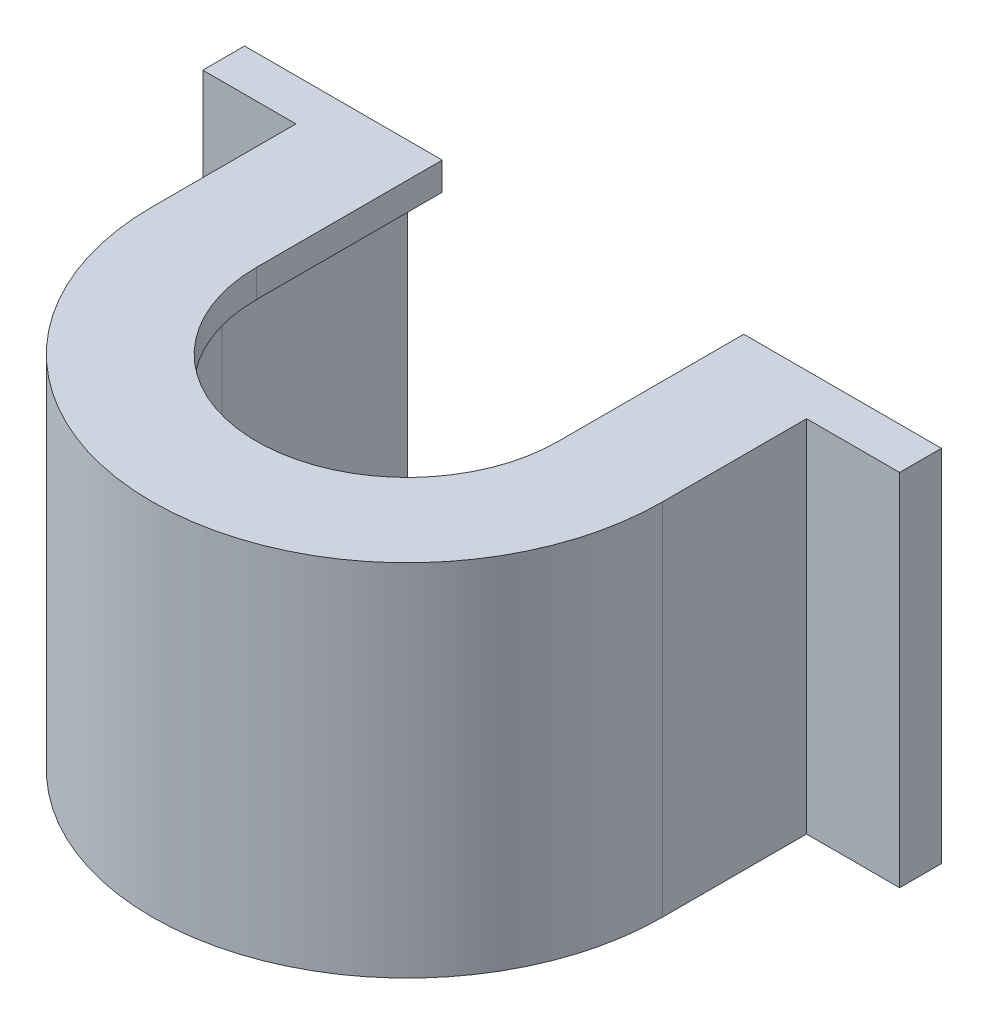
ISO-10303-21;
HEADER;
FILE_DESCRIPTION(('STEP AP214'),'2;1');
FILE_NAME('part.step','',(''),(''),'','','');
FILE_SCHEMA(('AUTOMOTIVE_DESIGN { 1 0 10303 214 1 1 1 1 }'));
ENDSEC;
DATA;
#1=APPLICATION_CONTEXT('core data for automotive mechanical design processes');
#2=APPLICATION_PROTOCOL_DEFINITION('international standard','automotive_design',2000,#1);
#3=PRODUCT_CONTEXT('',#1,'mechanical');
#4=PRODUCT('Part','Part','',(#3));
#5=PRODUCT_RELATED_PRODUCT_CATEGORY('part','',(#4));
#6=PRODUCT_DEFINITION_FORMATION('','',#4);
#7=PRODUCT_DEFINITION_CONTEXT('part definition',#1,'design');
#8=PRODUCT_DEFINITION('design','',#6,#7);
#9=PRODUCT_DEFINITION_SHAPE('','',#8);
#10=(LENGTH_UNIT() NAMED_UNIT(*) SI_UNIT(.MILLI.,.METRE.));
#11=(NAMED_UNIT(*) PLANE_ANGLE_UNIT() SI_UNIT($,.RADIAN.));
#12=(NAMED_UNIT(*) SI_UNIT($,.STERADIAN.) SOLID_ANGLE_UNIT());
#13=UNCERTAINTY_MEASURE_WITH_UNIT(LENGTH_MEASURE(1.E-05),#10,'distance_accuracy_value','');
#14=(GEOMETRIC_REPRESENTATION_CONTEXT(3) GLOBAL_UNCERTAINTY_ASSIGNED_CONTEXT((#13)) GLOBAL_UNIT_ASSIGNED_CONTEXT((#10,
#11,#12)) REPRESENTATION_CONTEXT('',''));
#15=CARTESIAN_POINT('',(0.,0.,0.));
#16=DIRECTION('',(0.,0.,1.));
#17=DIRECTION('',(1.,0.,0.));
#18=AXIS2_PLACEMENT_3D('',#15,#16,#17);
#19=CARTESIAN_POINT('',(-18.32,20.,0.));
#20=DIRECTION('',(-1.,0.,0.));
#21=DIRECTION('',(0.,0.,1.));
#22=AXIS2_PLACEMENT_3D('',#19,#20,#21);
#23=PLANE('',#22);
#24=DIRECTION('',(0.,0.,-1.));
#25=VECTOR('',#24,1.);
#26=CARTESIAN_POINT('',(-18.32,8.89,0.));
#27=LINE('',#26,#25);
#28=CARTESIAN_POINT('',(-18.32,8.89,0.));
#29=VERTEX_POINT('',#28);
#30=CARTESIAN_POINT('',(-18.32,8.89,-10.32));
#31=VERTEX_POINT('',#30);
#32=EDGE_CURVE('E53',#29,#31,#27,.T.);
#33=ORIENTED_EDGE('',*,*,#32,.F.);
#34=DIRECTION('',(0.,-1.,0.));
#35=VECTOR('',#34,1.);
#36=CARTESIAN_POINT('',(-18.32,20.,0.));
#37=LINE('',#36,#35);
#38=CARTESIAN_POINT('',(-18.32,34.7,0.));
#39=VERTEX_POINT('',#38);
#40=EDGE_CURVE('E46',#39,#29,#37,.T.);
#41=ORIENTED_EDGE('',*,*,#40,.F.);
#42=DIRECTION('',(0.,0.,1.));
#43=VECTOR('',#42,1.);
#44=CARTESIAN_POINT('',(-18.32,34.7,0.));
#45=LINE('',#44,#43);
#46=CARTESIAN_POINT('',(-18.32,34.7,-10.32));
#47=VERTEX_POINT('',#46);
#48=EDGE_CURVE('E224',#47,#39,#45,.T.);
#49=ORIENTED_EDGE('',*,*,#48,.F.);
#50=DIRECTION('',(0.,-1.,0.));
#51=VECTOR('',#50,1.);
#52=CARTESIAN_POINT('',(-18.32,20.,-10.32));
#53=LINE('',#52,#51);
#54=EDGE_CURVE('E182',#47,#31,#53,.T.);
#55=ORIENTED_EDGE('',*,*,#54,.T.);
#56=EDGE_LOOP('',(#33,#41,#49,#55));
#57=FACE_BOUND('',#56,.T.);
#58=ADVANCED_FACE('F38',(#57),#23,.T.);
#59=CARTESIAN_POINT('',(0.,20.,0.));
#60=DIRECTION('',(0.,-1.,0.));
#61=DIRECTION('',(0.,0.,-1.));
#62=AXIS2_PLACEMENT_3D('',#59,#60,#61);
#63=CYLINDRICAL_SURFACE('',#62,18.32);
#64=ORIENTED_EDGE('',*,*,#40,.T.);
#65=CARTESIAN_POINT('',(0.,8.89,0.));
#66=DIRECTION('',(0.,1.,0.));
#67=DIRECTION('',(-1.,0.,0.));
#68=AXIS2_PLACEMENT_3D('',#65,#66,#67);
#69=CIRCLE('',#68,18.32);
#70=CARTESIAN_POINT('',(18.32,8.89,0.));
#71=VERTEX_POINT('',#70);
#72=EDGE_CURVE('E217',#29,#71,#69,.T.);
#73=ORIENTED_EDGE('',*,*,#72,.T.);
#74=DIRECTION('',(0.,-1.,0.));
#75=VECTOR('',#74,1.);
#76=CARTESIAN_POINT('',(18.32,20.,0.));
#77=LINE('',#76,#75);
#78=CARTESIAN_POINT('',(18.32,34.7,0.));
#79=VERTEX_POINT('',#78);
#80=EDGE_CURVE('E208',#79,#71,#77,.T.);
#81=ORIENTED_EDGE('',*,*,#80,.F.);
#82=CARTESIAN_POINT('',(0.,34.7,0.));
#83=DIRECTION('',(0.,1.,0.));
#84=DIRECTION('',(0.,0.,1.));
#85=AXIS2_PLACEMENT_3D('',#82,#83,#84);
#86=CIRCLE('',#85,18.32);
#87=EDGE_CURVE('E219',#39,#79,#86,.T.);
#88=ORIENTED_EDGE('',*,*,#87,.F.);
#89=EDGE_LOOP('',(#64,#73,#81,#88));
#90=FACE_BOUND('',#89,.T.);
#91=ADVANCED_FACE('F216',(#90),#63,.T.);
#92=CARTESIAN_POINT('',(18.32,20.,0.));
#93=DIRECTION('',(-1.,0.,0.));
#94=DIRECTION('',(0.,0.,1.));
#95=AXIS2_PLACEMENT_3D('',#92,#93,#94);
#96=PLANE('',#95);
#97=ORIENTED_EDGE('',*,*,#80,.T.);
#98=DIRECTION('',(0.,0.,-1.));
#99=VECTOR('',#98,1.);
#100=CARTESIAN_POINT('',(18.32,8.89,0.));
#101=LINE('',#100,#99);
#102=CARTESIAN_POINT('',(18.32,8.89,-10.32));
#103=VERTEX_POINT('',#102);
#104=EDGE_CURVE('E334',#71,#103,#101,.T.);
#105=ORIENTED_EDGE('',*,*,#104,.T.);
#106=DIRECTION('',(0.,-1.,0.));
#107=VECTOR('',#106,1.);
#108=CARTESIAN_POINT('',(18.32,20.,-10.32));
#109=LINE('',#108,#107);
#110=CARTESIAN_POINT('',(18.32,34.7,-10.32));
#111=VERTEX_POINT('',#110);
#112=EDGE_CURVE('E204',#111,#103,#109,.T.);
#113=ORIENTED_EDGE('',*,*,#112,.F.);
#114=DIRECTION('',(0.,0.,-1.));
#115=VECTOR('',#114,1.);
#116=CARTESIAN_POINT('',(18.32,34.7,0.));
#117=LINE('',#116,#115);
#118=EDGE_CURVE('E236',#79,#111,#117,.T.);
#119=ORIENTED_EDGE('',*,*,#118,.F.);
#120=EDGE_LOOP('',(#97,#105,#113,#119));
#121=FACE_BOUND('',#120,.T.);
#122=ADVANCED_FACE('F342',(#121),#96,.F.);
#123=CARTESIAN_POINT('',(0.,20.,-10.32));
#124=DIRECTION('',(0.,0.,1.));
#125=DIRECTION('',(1.,0.,0.));
#126=AXIS2_PLACEMENT_3D('',#123,#124,#125);
#127=PLANE('',#126);
#128=DIRECTION('',(-1.,0.,0.));
#129=VECTOR('',#128,1.);
#130=CARTESIAN_POINT('',(0.,8.89,-10.32));
#131=LINE('',#130,#129);
#132=CARTESIAN_POINT('',(25.,8.89,-10.32));
#133=VERTEX_POINT('',#132);
#134=EDGE_CURVE('E331',#133,#103,#131,.T.);
#135=ORIENTED_EDGE('',*,*,#134,.F.);
#136=DIRECTION('',(0.,-1.,0.));
#137=VECTOR('',#136,1.);
#138=CARTESIAN_POINT('',(25.,20.,-10.32));
#139=LINE('',#138,#137);
#140=CARTESIAN_POINT('',(25.,34.7,-10.32));
#141=VERTEX_POINT('',#140);
#142=EDGE_CURVE('E200',#141,#133,#139,.T.);
#143=ORIENTED_EDGE('',*,*,#142,.F.);
#144=DIRECTION('',(1.,0.,0.));
#145=VECTOR('',#144,1.);
#146=CARTESIAN_POINT('',(0.,34.7,-10.32));
#147=LINE('',#146,#145);
#148=EDGE_CURVE('E243',#111,#141,#147,.T.);
#149=ORIENTED_EDGE('',*,*,#148,.F.);
#150=ORIENTED_EDGE('',*,*,#112,.T.);
#151=EDGE_LOOP('',(#135,#143,#149,#150));
#152=FACE_BOUND('',#151,.T.);
#153=ADVANCED_FACE('F346',(#152),#127,.T.);
#154=CARTESIAN_POINT('',(25.,20.,0.));
#155=DIRECTION('',(1.,0.,0.));
#156=DIRECTION('',(0.,0.,-1.));
#157=AXIS2_PLACEMENT_3D('',#154,#155,#156);
#158=PLANE('',#157);
#159=DIRECTION('',(0.,0.,1.));
#160=VECTOR('',#159,1.);
#161=CARTESIAN_POINT('',(25.,8.89,0.));
#162=LINE('',#161,#160);
#163=CARTESIAN_POINT('',(25.,8.89,-13.32));
#164=VERTEX_POINT('',#163);
#165=EDGE_CURVE('E328',#164,#133,#162,.T.);
#166=ORIENTED_EDGE('',*,*,#165,.F.);
#167=DIRECTION('',(0.,-1.,0.));
#168=VECTOR('',#167,1.);
#169=CARTESIAN_POINT('',(25.,20.,-13.32));
#170=LINE('',#169,#168);
#171=CARTESIAN_POINT('',(25.,34.7,-13.32));
#172=VERTEX_POINT('',#171);
#173=EDGE_CURVE('E196',#172,#164,#170,.T.);
#174=ORIENTED_EDGE('',*,*,#173,.F.);
#175=DIRECTION('',(0.,0.,-1.));
#176=VECTOR('',#175,1.);
#177=CARTESIAN_POINT('',(25.,34.7,0.));
#178=LINE('',#177,#176);
#179=EDGE_CURVE('E247',#141,#172,#178,.T.);
#180=ORIENTED_EDGE('',*,*,#179,.F.);
#181=ORIENTED_EDGE('',*,*,#142,.T.);
#182=EDGE_LOOP('',(#166,#174,#180,#181));
#183=FACE_BOUND('',#182,.T.);
#184=ADVANCED_FACE('F351',(#183),#158,.T.);
#185=CARTESIAN_POINT('',(0.,20.,-13.32));
#186=DIRECTION('',(0.,0.,-1.));
#187=DIRECTION('',(-1.,0.,0.));
#188=AXIS2_PLACEMENT_3D('',#185,#186,#187);
#189=PLANE('',#188);
#190=DIRECTION('',(1.,0.,0.));
#191=VECTOR('',#190,1.);
#192=CARTESIAN_POINT('',(0.,8.89,-13.32));
#193=LINE('',#192,#191);
#194=CARTESIAN_POINT('',(13.32,8.89,-13.32));
#195=VERTEX_POINT('',#194);
#196=EDGE_CURVE('E325',#195,#164,#193,.T.);
#197=ORIENTED_EDGE('',*,*,#196,.F.);
#198=DIRECTION('',(0.,-1.,0.));
#199=VECTOR('',#198,1.);
#200=CARTESIAN_POINT('',(13.32,20.,-13.32));
#201=LINE('',#200,#199);
#202=CARTESIAN_POINT('',(13.32,32.7,-13.32));
#203=VERTEX_POINT('',#202);
#204=EDGE_CURVE('E192',#203,#195,#201,.T.);
#205=ORIENTED_EDGE('',*,*,#204,.F.);
#206=DIRECTION('',(-1.,0.,0.));
#207=VECTOR('',#206,1.);
#208=CARTESIAN_POINT('',(0.,32.7,-13.32));
#209=LINE('',#208,#207);
#210=CARTESIAN_POINT('',(10.82,32.7,-13.32));
#211=VERTEX_POINT('',#210);
#212=EDGE_CURVE('E269',#203,#211,#209,.T.);
#213=ORIENTED_EDGE('',*,*,#212,.T.);
#214=DIRECTION('',(0.,-1.,0.));
#215=VECTOR('',#214,1.);
#216=CARTESIAN_POINT('',(10.82,34.7,-13.32));
#217=LINE('',#216,#215);
#218=CARTESIAN_POINT('',(10.82,34.7,-13.32));
#219=VERTEX_POINT('',#218);
#220=EDGE_CURVE('E294',#219,#211,#217,.T.);
#221=ORIENTED_EDGE('',*,*,#220,.F.);
#222=DIRECTION('',(-1.,0.,0.));
#223=VECTOR('',#222,1.);
#224=CARTESIAN_POINT('',(0.,34.7,-13.32));
#225=LINE('',#224,#223);
#226=EDGE_CURVE('E251',#172,#219,#225,.T.);
#227=ORIENTED_EDGE('',*,*,#226,.F.);
#228=ORIENTED_EDGE('',*,*,#173,.T.);
#229=EDGE_LOOP('',(#197,#205,#213,#221,#227,#228));
#230=FACE_BOUND('',#229,.T.);
#231=ADVANCED_FACE('F354',(#230),#189,.T.);
#232=CARTESIAN_POINT('',(13.32,20.,0.));
#233=DIRECTION('',(-1.,0.,0.));
#234=DIRECTION('',(0.,0.,1.));
#235=AXIS2_PLACEMENT_3D('',#232,#233,#234);
#236=PLANE('',#235);
#237=DIRECTION('',(0.,0.,-1.));
#238=VECTOR('',#237,1.);
#239=CARTESIAN_POINT('',(13.32,8.89,0.));
#240=LINE('',#239,#238);
#241=CARTESIAN_POINT('',(13.32,8.89,0.));
#242=VERTEX_POINT('',#241);
#243=EDGE_CURVE('E322',#242,#195,#240,.T.);
#244=ORIENTED_EDGE('',*,*,#243,.F.);
#245=DIRECTION('',(0.,-1.,0.));
#246=VECTOR('',#245,1.);
#247=CARTESIAN_POINT('',(13.32,20.,0.));
#248=LINE('',#247,#246);
#249=CARTESIAN_POINT('',(13.32,32.7,0.));
#250=VERTEX_POINT('',#249);
#251=EDGE_CURVE('E188',#250,#242,#248,.T.);
#252=ORIENTED_EDGE('',*,*,#251,.F.);
#253=DIRECTION('',(0.,0.,1.));
#254=VECTOR('',#253,1.);
#255=CARTESIAN_POINT('',(13.32,32.7,-13.32));
#256=LINE('',#255,#254);
#257=EDGE_CURVE('E298',#203,#250,#256,.T.);
#258=ORIENTED_EDGE('',*,*,#257,.F.);
#259=ORIENTED_EDGE('',*,*,#204,.T.);
#260=EDGE_LOOP('',(#244,#252,#258,#259));
#261=FACE_BOUND('',#260,.T.);
#262=ADVANCED_FACE('F375',(#261),#236,.T.);
#263=CARTESIAN_POINT('',(0.,20.,0.));
#264=DIRECTION('',(0.,-1.,0.));
#265=DIRECTION('',(0.,0.,-1.));
#266=AXIS2_PLACEMENT_3D('',#263,#264,#265);
#267=CYLINDRICAL_SURFACE('',#266,13.32);
#268=CARTESIAN_POINT('',(0.,8.89,0.));
#269=DIRECTION('',(0.,1.,0.));
#270=DIRECTION('',(-1.,0.,0.));
#271=AXIS2_PLACEMENT_3D('',#268,#269,#270);
#272=CIRCLE('',#271,13.32);
#273=CARTESIAN_POINT('',(-13.32,8.89,0.));
#274=VERTEX_POINT('',#273);
#275=EDGE_CURVE('E319',#274,#242,#272,.T.);
#276=ORIENTED_EDGE('',*,*,#275,.F.);
#277=DIRECTION('',(0.,-1.,0.));
#278=VECTOR('',#277,1.);
#279=CARTESIAN_POINT('',(-13.32,20.,0.));
#280=LINE('',#279,#278);
#281=CARTESIAN_POINT('',(-13.32,32.7,0.));
#282=VERTEX_POINT('',#281);
#283=EDGE_CURVE('E60',#282,#274,#280,.T.);
#284=ORIENTED_EDGE('',*,*,#283,.F.);
#285=CARTESIAN_POINT('',(0.,32.7,0.));
#286=DIRECTION('',(0.,-1.,0.));
#287=DIRECTION('',(0.,0.,1.));
#288=AXIS2_PLACEMENT_3D('',#285,#286,#287);
#289=CIRCLE('',#288,13.32);
#290=EDGE_CURVE('E302',#250,#282,#289,.T.);
#291=ORIENTED_EDGE('',*,*,#290,.F.);
#292=ORIENTED_EDGE('',*,*,#251,.T.);
#293=EDGE_LOOP('',(#276,#284,#291,#292));
#294=FACE_BOUND('',#293,.T.);
#295=ADVANCED_FACE('F372',(#294),#267,.F.);
#296=CARTESIAN_POINT('',(-13.32,20.,0.));
#297=DIRECTION('',(-1.,0.,0.));
#298=DIRECTION('',(0.,0.,1.));
#299=AXIS2_PLACEMENT_3D('',#296,#297,#298);
#300=PLANE('',#299);
#301=ORIENTED_EDGE('',*,*,#283,.T.);
#302=DIRECTION('',(0.,0.,-1.));
#303=VECTOR('',#302,1.);
#304=CARTESIAN_POINT('',(-13.32,8.89,0.));
#305=LINE('',#304,#303);
#306=CARTESIAN_POINT('',(-13.32,8.89,-13.32));
#307=VERTEX_POINT('',#306);
#308=EDGE_CURVE('E170',#274,#307,#305,.T.);
#309=ORIENTED_EDGE('',*,*,#308,.T.);
#310=DIRECTION('',(0.,-1.,0.));
#311=VECTOR('',#310,1.);
#312=CARTESIAN_POINT('',(-13.32,20.,-13.32));
#313=LINE('',#312,#311);
#314=CARTESIAN_POINT('',(-13.32,32.7,-13.32));
#315=VERTEX_POINT('',#314);
#316=EDGE_CURVE('E167',#315,#307,#313,.T.);
#317=ORIENTED_EDGE('',*,*,#316,.F.);
#318=DIRECTION('',(0.,0.,-1.));
#319=VECTOR('',#318,1.);
#320=CARTESIAN_POINT('',(-13.32,32.7,0.));
#321=LINE('',#320,#319);
#322=EDGE_CURVE('E306',#282,#315,#321,.T.);
#323=ORIENTED_EDGE('',*,*,#322,.F.);
#324=EDGE_LOOP('',(#301,#309,#317,#323));
#325=FACE_BOUND('',#324,.T.);
#326=ADVANCED_FACE('F370',(#325),#300,.F.);
#327=CARTESIAN_POINT('',(0.,20.,-13.32));
#328=DIRECTION('',(0.,0.,1.));
#329=DIRECTION('',(1.,0.,0.));
#330=AXIS2_PLACEMENT_3D('',#327,#328,#329);
#331=PLANE('',#330);
#332=ORIENTED_EDGE('',*,*,#316,.T.);
#333=DIRECTION('',(-1.,0.,0.));
#334=VECTOR('',#333,1.);
#335=CARTESIAN_POINT('',(0.,8.89,-13.32));
#336=LINE('',#335,#334);
#337=CARTESIAN_POINT('',(-25.,8.89,-13.32));
#338=VERTEX_POINT('',#337);
#339=EDGE_CURVE('E153',#307,#338,#336,.T.);
#340=ORIENTED_EDGE('',*,*,#339,.T.);
#341=DIRECTION('',(0.,-1.,0.));
#342=VECTOR('',#341,1.);
#343=CARTESIAN_POINT('',(-25.,20.,-13.32));
#344=LINE('',#343,#342);
#345=CARTESIAN_POINT('',(-25.,34.7,-13.32));
#346=VERTEX_POINT('',#345);
#347=EDGE_CURVE('E164',#346,#338,#344,.T.);
#348=ORIENTED_EDGE('',*,*,#347,.F.);
#349=DIRECTION('',(1.,0.,0.));
#350=VECTOR('',#349,1.);
#351=CARTESIAN_POINT('',(0.,34.7,-13.32));
#352=LINE('',#351,#350);
#353=CARTESIAN_POINT('',(-10.82,34.7,-13.32));
#354=VERTEX_POINT('',#353);
#355=EDGE_CURVE('E284',#346,#354,#352,.T.);
#356=ORIENTED_EDGE('',*,*,#355,.T.);
#357=DIRECTION('',(0.,-1.,0.));
#358=VECTOR('',#357,1.);
#359=CARTESIAN_POINT('',(-10.82,34.7,-13.32));
#360=LINE('',#359,#358);
#361=CARTESIAN_POINT('',(-10.82,32.7,-13.32));
#362=VERTEX_POINT('',#361);
#363=EDGE_CURVE('E266',#354,#362,#360,.T.);
#364=ORIENTED_EDGE('',*,*,#363,.T.);
#365=DIRECTION('',(1.,0.,0.));
#366=VECTOR('',#365,1.);
#367=CARTESIAN_POINT('',(0.,32.7,-13.32));
#368=LINE('',#367,#366);
#369=EDGE_CURVE('E169',#315,#362,#368,.T.);
#370=ORIENTED_EDGE('',*,*,#369,.F.);
#371=EDGE_LOOP('',(#332,#340,#348,#356,#364,#370));
#372=FACE_BOUND('',#371,.T.);
#373=ADVANCED_FACE('F162',(#372),#331,.F.);
#374=CARTESIAN_POINT('',(-25.,20.,0.));
#375=DIRECTION('',(1.,0.,0.));
#376=DIRECTION('',(0.,0.,-1.));
#377=AXIS2_PLACEMENT_3D('',#374,#375,#376);
#378=PLANE('',#377);
#379=ORIENTED_EDGE('',*,*,#347,.T.);
#380=DIRECTION('',(0.,0.,1.));
#381=VECTOR('',#380,1.);
#382=CARTESIAN_POINT('',(-25.,8.89,-22.));
#383=LINE('',#382,#381);
#384=CARTESIAN_POINT('',(-25.,8.89,-10.32));
#385=VERTEX_POINT('',#384);
#386=EDGE_CURVE('E150',#338,#385,#383,.T.);
#387=ORIENTED_EDGE('',*,*,#386,.T.);
#388=DIRECTION('',(0.,-1.,0.));
#389=VECTOR('',#388,1.);
#390=CARTESIAN_POINT('',(-25.,20.,-10.32));
#391=LINE('',#390,#389);
#392=CARTESIAN_POINT('',(-25.,34.7,-10.32));
#393=VERTEX_POINT('',#392);
#394=EDGE_CURVE('E177',#393,#385,#391,.T.);
#395=ORIENTED_EDGE('',*,*,#394,.F.);
#396=DIRECTION('',(0.,0.,1.));
#397=VECTOR('',#396,1.);
#398=CARTESIAN_POINT('',(-25.,34.7,0.));
#399=LINE('',#398,#397);
#400=EDGE_CURVE('E174',#346,#393,#399,.T.);
#401=ORIENTED_EDGE('',*,*,#400,.F.);
#402=EDGE_LOOP('',(#379,#387,#395,#401));
#403=FACE_BOUND('',#402,.T.);
#404=ADVANCED_FACE('F172',(#403),#378,.F.);
#405=CARTESIAN_POINT('',(0.,20.,-10.32));
#406=DIRECTION('',(0.,0.,-1.));
#407=DIRECTION('',(-1.,0.,0.));
#408=AXIS2_PLACEMENT_3D('',#405,#406,#407);
#409=PLANE('',#408);
#410=ORIENTED_EDGE('',*,*,#394,.T.);
#411=DIRECTION('',(1.,0.,0.));
#412=VECTOR('',#411,1.);
#413=CARTESIAN_POINT('',(0.,8.89,-10.32));
#414=LINE('',#413,#412);
#415=EDGE_CURVE('E11',#385,#31,#414,.T.);
#416=ORIENTED_EDGE('',*,*,#415,.T.);
#417=ORIENTED_EDGE('',*,*,#54,.F.);
#418=DIRECTION('',(1.,0.,0.));
#419=VECTOR('',#418,1.);
#420=CARTESIAN_POINT('',(0.,34.7,-10.32));
#421=LINE('',#420,#419);
#422=EDGE_CURVE('E231',#393,#47,#421,.T.);
#423=ORIENTED_EDGE('',*,*,#422,.F.);
#424=EDGE_LOOP('',(#410,#416,#417,#423));
#425=FACE_BOUND('',#424,.T.);
#426=ADVANCED_FACE('F311',(#425),#409,.F.);
#427=CARTESIAN_POINT('',(0.,32.7,0.));
#428=DIRECTION('',(0.,1.,0.));
#429=DIRECTION('',(0.,0.,1.));
#430=AXIS2_PLACEMENT_3D('',#427,#428,#429);
#431=PLANE('',#430);
#432=ORIENTED_EDGE('',*,*,#212,.F.);
#433=ORIENTED_EDGE('',*,*,#257,.T.);
#434=ORIENTED_EDGE('',*,*,#290,.T.);
#435=ORIENTED_EDGE('',*,*,#322,.T.);
#436=ORIENTED_EDGE('',*,*,#369,.T.);
#437=DIRECTION('',(0.,0.,1.));
#438=VECTOR('',#437,1.);
#439=CARTESIAN_POINT('',(-10.82,32.7,0.));
#440=LINE('',#439,#438);
#441=CARTESIAN_POINT('',(-10.82,32.7,0.));
#442=VERTEX_POINT('',#441);
#443=EDGE_CURVE('E280',#362,#442,#440,.T.);
#444=ORIENTED_EDGE('',*,*,#443,.T.);
#445=CARTESIAN_POINT('',(0.,32.7,0.));
#446=DIRECTION('',(0.,1.,0.));
#447=DIRECTION('',(0.,0.,1.));
#448=AXIS2_PLACEMENT_3D('',#445,#446,#447);
#449=CIRCLE('',#448,10.82);
#450=CARTESIAN_POINT('',(10.82,32.7,0.));
#451=VERTEX_POINT('',#450);
#452=EDGE_CURVE('E276',#442,#451,#449,.T.);
#453=ORIENTED_EDGE('',*,*,#452,.T.);
#454=DIRECTION('',(0.,0.,-1.));
#455=VECTOR('',#454,1.);
#456=CARTESIAN_POINT('',(10.82,32.7,0.));
#457=LINE('',#456,#455);
#458=EDGE_CURVE('E272',#451,#211,#457,.T.);
#459=ORIENTED_EDGE('',*,*,#458,.T.);
#460=EDGE_LOOP('',(#432,#433,#434,#435,#436,#444,#453,#459));
#461=FACE_BOUND('',#460,.T.);
#462=ADVANCED_FACE('F368',(#461),#431,.F.);
#463=CARTESIAN_POINT('',(10.82,34.7,0.));
#464=DIRECTION('',(-1.,0.,0.));
#465=DIRECTION('',(0.,0.,1.));
#466=AXIS2_PLACEMENT_3D('',#463,#464,#465);
#467=PLANE('',#466);
#468=ORIENTED_EDGE('',*,*,#458,.F.);
#469=DIRECTION('',(0.,-1.,0.));
#470=VECTOR('',#469,1.);
#471=CARTESIAN_POINT('',(10.82,34.7,0.));
#472=LINE('',#471,#470);
#473=CARTESIAN_POINT('',(10.82,34.7,0.));
#474=VERTEX_POINT('',#473);
#475=EDGE_CURVE('E291',#474,#451,#472,.T.);
#476=ORIENTED_EDGE('',*,*,#475,.F.);
#477=DIRECTION('',(0.,0.,-1.));
#478=VECTOR('',#477,1.);
#479=CARTESIAN_POINT('',(10.82,34.7,0.));
#480=LINE('',#479,#478);
#481=EDGE_CURVE('E254',#474,#219,#480,.T.);
#482=ORIENTED_EDGE('',*,*,#481,.T.);
#483=ORIENTED_EDGE('',*,*,#220,.T.);
#484=EDGE_LOOP('',(#468,#476,#482,#483));
#485=FACE_BOUND('',#484,.T.);
#486=ADVANCED_FACE('F376',(#485),#467,.T.);
#487=CARTESIAN_POINT('',(0.,34.7,0.));
#488=DIRECTION('',(0.,-1.,0.));
#489=DIRECTION('',(0.,0.,-1.));
#490=AXIS2_PLACEMENT_3D('',#487,#488,#489);
#491=CYLINDRICAL_SURFACE('',#490,10.82);
#492=ORIENTED_EDGE('',*,*,#452,.F.);
#493=DIRECTION('',(0.,-1.,0.));
#494=VECTOR('',#493,1.);
#495=CARTESIAN_POINT('',(-10.82,34.7,0.));
#496=LINE('',#495,#494);
#497=CARTESIAN_POINT('',(-10.82,34.7,0.));
#498=VERTEX_POINT('',#497);
#499=EDGE_CURVE('E288',#498,#442,#496,.T.);
#500=ORIENTED_EDGE('',*,*,#499,.F.);
#501=CARTESIAN_POINT('',(0.,34.7,0.));
#502=DIRECTION('',(0.,1.,0.));
#503=DIRECTION('',(0.,0.,1.));
#504=AXIS2_PLACEMENT_3D('',#501,#502,#503);
#505=CIRCLE('',#504,10.82);
#506=EDGE_CURVE('E258',#498,#474,#505,.T.);
#507=ORIENTED_EDGE('',*,*,#506,.T.);
#508=ORIENTED_EDGE('',*,*,#475,.T.);
#509=EDGE_LOOP('',(#492,#500,#507,#508));
#510=FACE_BOUND('',#509,.T.);
#511=ADVANCED_FACE('F361',(#510),#491,.F.);
#512=CARTESIAN_POINT('',(-10.82,34.7,0.));
#513=DIRECTION('',(1.,0.,0.));
#514=DIRECTION('',(0.,0.,-1.));
#515=AXIS2_PLACEMENT_3D('',#512,#513,#514);
#516=PLANE('',#515);
#517=ORIENTED_EDGE('',*,*,#443,.F.);
#518=ORIENTED_EDGE('',*,*,#363,.F.);
#519=DIRECTION('',(0.,0.,1.));
#520=VECTOR('',#519,1.);
#521=CARTESIAN_POINT('',(-10.82,34.7,0.));
#522=LINE('',#521,#520);
#523=EDGE_CURVE('E262',#354,#498,#522,.T.);
#524=ORIENTED_EDGE('',*,*,#523,.T.);
#525=ORIENTED_EDGE('',*,*,#499,.T.);
#526=EDGE_LOOP('',(#517,#518,#524,#525));
#527=FACE_BOUND('',#526,.T.);
#528=ADVANCED_FACE('F365',(#527),#516,.T.);
#529=CARTESIAN_POINT('',(0.,34.7,0.));
#530=DIRECTION('',(0.,1.,0.));
#531=DIRECTION('',(0.,0.,1.));
#532=AXIS2_PLACEMENT_3D('',#529,#530,#531);
#533=PLANE('',#532);
#534=ORIENTED_EDGE('',*,*,#355,.F.);
#535=ORIENTED_EDGE('',*,*,#400,.T.);
#536=ORIENTED_EDGE('',*,*,#422,.T.);
#537=ORIENTED_EDGE('',*,*,#48,.T.);
#538=ORIENTED_EDGE('',*,*,#87,.T.);
#539=ORIENTED_EDGE('',*,*,#118,.T.);
#540=ORIENTED_EDGE('',*,*,#148,.T.);
#541=ORIENTED_EDGE('',*,*,#179,.T.);
#542=ORIENTED_EDGE('',*,*,#226,.T.);
#543=ORIENTED_EDGE('',*,*,#481,.F.);
#544=ORIENTED_EDGE('',*,*,#506,.F.);
#545=ORIENTED_EDGE('',*,*,#523,.F.);
#546=EDGE_LOOP('',(#534,#535,#536,#537,#538,#539,#540,#541,#542,#543,#544,#545));
#547=FACE_BOUND('',#546,.T.);
#548=ADVANCED_FACE('F227',(#547),#533,.T.);
#549=CARTESIAN_POINT('',(-25.,8.89,-22.));
#550=DIRECTION('',(0.,1.,0.));
#551=DIRECTION('',(-1.,0.,0.));
#552=AXIS2_PLACEMENT_3D('',#549,#550,#551);
#553=PLANE('',#552);
#554=ORIENTED_EDGE('',*,*,#308,.F.);
#555=ORIENTED_EDGE('',*,*,#275,.T.);
#556=ORIENTED_EDGE('',*,*,#243,.T.);
#557=ORIENTED_EDGE('',*,*,#196,.T.);
#558=ORIENTED_EDGE('',*,*,#165,.T.);
#559=ORIENTED_EDGE('',*,*,#134,.T.);
#560=ORIENTED_EDGE('',*,*,#104,.F.);
#561=ORIENTED_EDGE('',*,*,#72,.F.);
#562=ORIENTED_EDGE('',*,*,#32,.T.);
#563=ORIENTED_EDGE('',*,*,#415,.F.);
#564=ORIENTED_EDGE('',*,*,#386,.F.);
#565=ORIENTED_EDGE('',*,*,#339,.F.);
#566=EDGE_LOOP('',(#554,#555,#556,#557,#558,#559,#560,#561,#562,#563,#564,#565));
#567=FACE_BOUND('',#566,.T.);
#568=ADVANCED_FACE('F152',(#567),#553,.F.);
#569=CLOSED_SHELL('',(#58,#91,#122,#153,#184,#231,#262,#295,#326,#373,#404,#426,#462,#486,#511,
#528,#548,#568));
#570=MANIFOLD_SOLID_BREP('B2',#569);
#571=ADVANCED_BREP_SHAPE_REPRESENTATION('',(#18,#570),#14);
#572=SHAPE_DEFINITION_REPRESENTATION(#9,#571);
ENDSEC;
END-ISO-10303-21;
